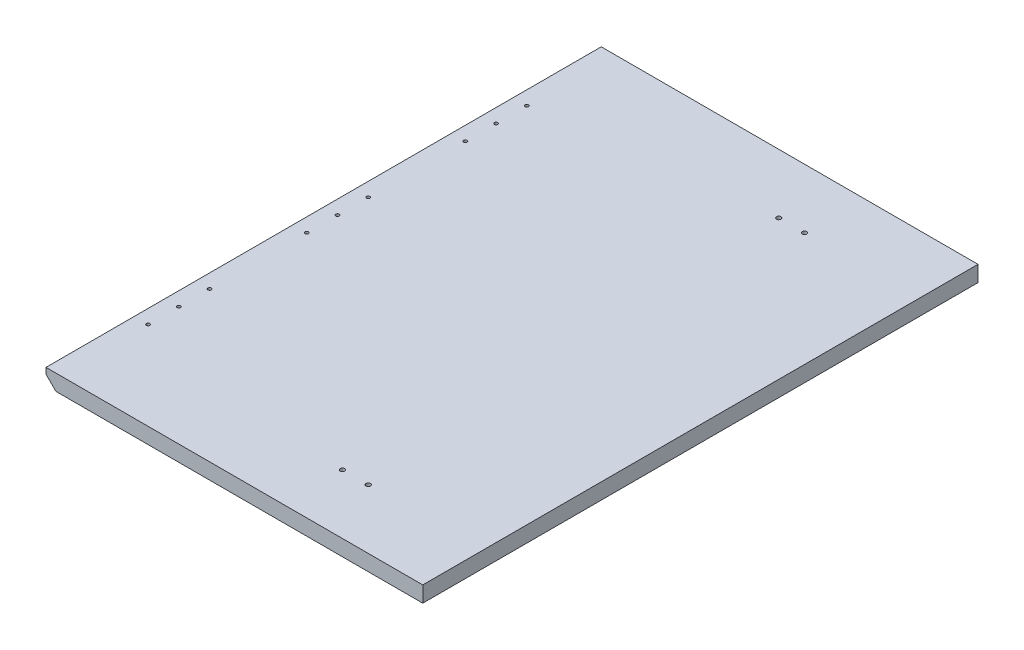
ISO-10303-21;
HEADER;
FILE_DESCRIPTION(('STEP AP214'),'2;1');
FILE_NAME('part.step','',(''),(''),'','','');
FILE_SCHEMA(('AUTOMOTIVE_DESIGN { 1 0 10303 214 1 1 1 1 }'));
ENDSEC;
DATA;
#1=APPLICATION_CONTEXT('core data for automotive mechanical design processes');
#2=APPLICATION_PROTOCOL_DEFINITION('international standard','automotive_design',2000,#1);
#3=PRODUCT_CONTEXT('',#1,'mechanical');
#4=PRODUCT('Part','Part','',(#3));
#5=PRODUCT_RELATED_PRODUCT_CATEGORY('part','',(#4));
#6=PRODUCT_DEFINITION_FORMATION('','',#4);
#7=PRODUCT_DEFINITION_CONTEXT('part definition',#1,'design');
#8=PRODUCT_DEFINITION('design','',#6,#7);
#9=PRODUCT_DEFINITION_SHAPE('','',#8);
#10=(LENGTH_UNIT() NAMED_UNIT(*) SI_UNIT(.MILLI.,.METRE.));
#11=(NAMED_UNIT(*) PLANE_ANGLE_UNIT() SI_UNIT($,.RADIAN.));
#12=(NAMED_UNIT(*) SI_UNIT($,.STERADIAN.) SOLID_ANGLE_UNIT());
#13=UNCERTAINTY_MEASURE_WITH_UNIT(LENGTH_MEASURE(1.E-05),#10,'distance_accuracy_value','');
#14=(GEOMETRIC_REPRESENTATION_CONTEXT(3) GLOBAL_UNCERTAINTY_ASSIGNED_CONTEXT((#13)) GLOBAL_UNIT_ASSIGNED_CONTEXT((#10,
#11,#12)) REPRESENTATION_CONTEXT('',''));
#15=CARTESIAN_POINT('',(0.,0.,0.));
#16=DIRECTION('',(0.,0.,1.));
#17=DIRECTION('',(1.,0.,0.));
#18=AXIS2_PLACEMENT_3D('',#15,#16,#17);
#19=CARTESIAN_POINT('',(190.,16.,280.));
#20=DIRECTION('',(-1.,0.,0.));
#21=DIRECTION('',(0.,0.,1.));
#22=AXIS2_PLACEMENT_3D('',#19,#20,#21);
#23=PLANE('',#22);
#24=DIRECTION('',(0.,0.,-1.));
#25=VECTOR('',#24,1.);
#26=CARTESIAN_POINT('',(190.,0.,280.));
#27=LINE('',#26,#25);
#28=CARTESIAN_POINT('',(190.,0.,280.));
#29=VERTEX_POINT('',#28);
#30=CARTESIAN_POINT('',(190.,0.,-280.));
#31=VERTEX_POINT('',#30);
#32=EDGE_CURVE('E225',#29,#31,#27,.T.);
#33=ORIENTED_EDGE('',*,*,#32,.T.);
#34=DIRECTION('',(0.,-1.,0.));
#35=VECTOR('',#34,1.);
#36=CARTESIAN_POINT('',(190.,16.,-280.));
#37=LINE('',#36,#35);
#38=CARTESIAN_POINT('',(190.,16.,-280.));
#39=VERTEX_POINT('',#38);
#40=EDGE_CURVE('E298',#39,#31,#37,.T.);
#41=ORIENTED_EDGE('',*,*,#40,.F.);
#42=DIRECTION('',(0.,0.,-1.));
#43=VECTOR('',#42,1.);
#44=CARTESIAN_POINT('',(190.,16.,280.));
#45=LINE('',#44,#43);
#46=CARTESIAN_POINT('',(190.,16.,280.));
#47=VERTEX_POINT('',#46);
#48=EDGE_CURVE('E274',#47,#39,#45,.T.);
#49=ORIENTED_EDGE('',*,*,#48,.F.);
#50=DIRECTION('',(0.,-1.,0.));
#51=VECTOR('',#50,1.);
#52=CARTESIAN_POINT('',(190.,16.,280.));
#53=LINE('',#52,#51);
#54=EDGE_CURVE('E284',#47,#29,#53,.T.);
#55=ORIENTED_EDGE('',*,*,#54,.T.);
#56=EDGE_LOOP('',(#33,#41,#49,#55));
#57=FACE_BOUND('',#56,.T.);
#58=ADVANCED_FACE('F47',(#57),#23,.F.);
#59=CARTESIAN_POINT('',(-190.,16.,-280.));
#60=DIRECTION('',(0.,0.,1.));
#61=DIRECTION('',(1.,0.,0.));
#62=AXIS2_PLACEMENT_3D('',#59,#60,#61);
#63=PLANE('',#62);
#64=DIRECTION('',(-1.,0.,0.));
#65=VECTOR('',#64,1.);
#66=CARTESIAN_POINT('',(-190.,0.,-280.));
#67=LINE('',#66,#65);
#68=CARTESIAN_POINT('',(-180.,0.,-280.));
#69=VERTEX_POINT('',#68);
#70=EDGE_CURVE('E287',#31,#69,#67,.T.);
#71=ORIENTED_EDGE('',*,*,#70,.T.);
#72=DIRECTION('',(-0.70710678118655,0.707106781186546,0.));
#73=VECTOR('',#72,1.);
#74=CARTESIAN_POINT('',(-190.,10.0000000000001,-280.));
#75=LINE('',#74,#73);
#76=CARTESIAN_POINT('',(-190.,10.0000000000001,-280.));
#77=VERTEX_POINT('',#76);
#78=EDGE_CURVE('E11',#69,#77,#75,.T.);
#79=ORIENTED_EDGE('',*,*,#78,.T.);
#80=DIRECTION('',(0.,-1.,0.));
#81=VECTOR('',#80,1.);
#82=CARTESIAN_POINT('',(-190.,16.,-280.));
#83=LINE('',#82,#81);
#84=CARTESIAN_POINT('',(-190.,16.,-280.));
#85=VERTEX_POINT('',#84);
#86=EDGE_CURVE('E295',#85,#77,#83,.T.);
#87=ORIENTED_EDGE('',*,*,#86,.F.);
#88=DIRECTION('',(-1.,0.,0.));
#89=VECTOR('',#88,1.);
#90=CARTESIAN_POINT('',(-190.,16.,-280.));
#91=LINE('',#90,#89);
#92=EDGE_CURVE('E277',#39,#85,#91,.T.);
#93=ORIENTED_EDGE('',*,*,#92,.F.);
#94=ORIENTED_EDGE('',*,*,#40,.T.);
#95=EDGE_LOOP('',(#71,#79,#87,#93,#94));
#96=FACE_BOUND('',#95,.T.);
#97=ADVANCED_FACE('F425',(#96),#63,.F.);
#98=CARTESIAN_POINT('',(-190.,16.,280.));
#99=DIRECTION('',(1.,0.,0.));
#100=DIRECTION('',(0.,0.,-1.));
#101=AXIS2_PLACEMENT_3D('',#98,#99,#100);
#102=PLANE('',#101);
#103=DIRECTION('',(0.,0.,-1.));
#104=VECTOR('',#103,1.);
#105=CARTESIAN_POINT('',(-190.,10.,117.5));
#106=LINE('',#105,#104);
#107=CARTESIAN_POINT('',(-190.,10.,202.5));
#108=VERTEX_POINT('',#107);
#109=CARTESIAN_POINT('',(-190.,10.,117.5));
#110=VERTEX_POINT('',#109);
#111=EDGE_CURVE('E185',#108,#110,#106,.T.);
#112=ORIENTED_EDGE('',*,*,#111,.F.);
#113=DIRECTION('',(0.,0.,1.));
#114=VECTOR('',#113,1.);
#115=CARTESIAN_POINT('',(-190.,10.0000000000001,280.));
#116=LINE('',#115,#114);
#117=CARTESIAN_POINT('',(-190.,10.0000000000001,280.));
#118=VERTEX_POINT('',#117);
#119=EDGE_CURVE('E190',#108,#118,#116,.T.);
#120=ORIENTED_EDGE('',*,*,#119,.T.);
#121=DIRECTION('',(0.,-1.,0.));
#122=VECTOR('',#121,1.);
#123=CARTESIAN_POINT('',(-190.,16.,280.));
#124=LINE('',#123,#122);
#125=CARTESIAN_POINT('',(-190.,16.,280.));
#126=VERTEX_POINT('',#125);
#127=EDGE_CURVE('E292',#126,#118,#124,.T.);
#128=ORIENTED_EDGE('',*,*,#127,.F.);
#129=DIRECTION('',(0.,0.,1.));
#130=VECTOR('',#129,1.);
#131=CARTESIAN_POINT('',(-190.,16.,280.));
#132=LINE('',#131,#130);
#133=EDGE_CURVE('E280',#85,#126,#132,.T.);
#134=ORIENTED_EDGE('',*,*,#133,.F.);
#135=ORIENTED_EDGE('',*,*,#86,.T.);
#136=DIRECTION('',(0.,0.,1.));
#137=VECTOR('',#136,1.);
#138=CARTESIAN_POINT('',(-190.,10.0000000000001,-202.5));
#139=LINE('',#138,#137);
#140=CARTESIAN_POINT('',(-190.,10.,-202.5));
#141=VERTEX_POINT('',#140);
#142=EDGE_CURVE('E301',#77,#141,#139,.T.);
#143=ORIENTED_EDGE('',*,*,#142,.T.);
#144=DIRECTION('',(0.,0.,-1.));
#145=VECTOR('',#144,1.);
#146=CARTESIAN_POINT('',(-190.,10.,-202.5));
#147=LINE('',#146,#145);
#148=CARTESIAN_POINT('',(-190.,10.,-117.5));
#149=VERTEX_POINT('',#148);
#150=EDGE_CURVE('E260',#149,#141,#147,.T.);
#151=ORIENTED_EDGE('',*,*,#150,.F.);
#152=DIRECTION('',(0.,0.,1.));
#153=VECTOR('',#152,1.);
#154=CARTESIAN_POINT('',(-190.,10.0000000000001,-42.5));
#155=LINE('',#154,#153);
#156=CARTESIAN_POINT('',(-190.,10.,-42.5));
#157=VERTEX_POINT('',#156);
#158=EDGE_CURVE('E191',#149,#157,#155,.T.);
#159=ORIENTED_EDGE('',*,*,#158,.T.);
#160=DIRECTION('',(0.,0.,-1.));
#161=VECTOR('',#160,1.);
#162=CARTESIAN_POINT('',(-190.,10.,-42.5));
#163=LINE('',#162,#161);
#164=CARTESIAN_POINT('',(-190.,10.,42.5));
#165=VERTEX_POINT('',#164);
#166=EDGE_CURVE('E189',#165,#157,#163,.T.);
#167=ORIENTED_EDGE('',*,*,#166,.F.);
#168=DIRECTION('',(0.,0.,1.));
#169=VECTOR('',#168,1.);
#170=CARTESIAN_POINT('',(-190.,10.0000000000001,117.5));
#171=LINE('',#170,#169);
#172=EDGE_CURVE('E171',#165,#110,#171,.T.);
#173=ORIENTED_EDGE('',*,*,#172,.T.);
#174=EDGE_LOOP('',(#112,#120,#128,#134,#135,#143,#151,#159,#167,#173));
#175=FACE_BOUND('',#174,.T.);
#176=ADVANCED_FACE('F182',(#175),#102,.F.);
#177=CARTESIAN_POINT('',(-190.,16.,280.));
#178=DIRECTION('',(0.,0.,-1.));
#179=DIRECTION('',(-1.,0.,0.));
#180=AXIS2_PLACEMENT_3D('',#177,#178,#179);
#181=PLANE('',#180);
#182=ORIENTED_EDGE('',*,*,#127,.T.);
#183=DIRECTION('',(0.70710678118655,-0.707106781186546,0.));
#184=VECTOR('',#183,1.);
#185=CARTESIAN_POINT('',(-190.,10.0000000000001,280.));
#186=LINE('',#185,#184);
#187=CARTESIAN_POINT('',(-180.,0.,280.));
#188=VERTEX_POINT('',#187);
#189=EDGE_CURVE('E306',#118,#188,#186,.T.);
#190=ORIENTED_EDGE('',*,*,#189,.T.);
#191=DIRECTION('',(1.,0.,0.));
#192=VECTOR('',#191,1.);
#193=CARTESIAN_POINT('',(-190.,0.,280.));
#194=LINE('',#193,#192);
#195=EDGE_CURVE('E278',#188,#29,#194,.T.);
#196=ORIENTED_EDGE('',*,*,#195,.T.);
#197=ORIENTED_EDGE('',*,*,#54,.F.);
#198=DIRECTION('',(1.,0.,0.));
#199=VECTOR('',#198,1.);
#200=CARTESIAN_POINT('',(-190.,16.,280.));
#201=LINE('',#200,#199);
#202=EDGE_CURVE('E282',#126,#47,#201,.T.);
#203=ORIENTED_EDGE('',*,*,#202,.F.);
#204=EDGE_LOOP('',(#182,#190,#196,#197,#203));
#205=FACE_BOUND('',#204,.T.);
#206=ADVANCED_FACE('F500',(#205),#181,.F.);
#207=CARTESIAN_POINT('',(0.,16.,0.));
#208=DIRECTION('',(0.,-1.,0.));
#209=DIRECTION('',(0.,0.,-1.));
#210=AXIS2_PLACEMENT_3D('',#207,#208,#209);
#211=PLANE('',#210);
#212=CARTESIAN_POINT('',(75.,16.,-220.));
#213=DIRECTION('',(0.,-1.,0.));
#214=DIRECTION('',(0.,0.,-1.));
#215=AXIS2_PLACEMENT_3D('',#212,#213,#214);
#216=CIRCLE('',#215,2.24789999999998);
#217=CARTESIAN_POINT('',(75.,16.,-222.2479));
#218=VERTEX_POINT('',#217);
#219=EDGE_CURVE('E52',#218,#218,#216,.T.);
#220=ORIENTED_EDGE('',*,*,#219,.T.);
#221=EDGE_LOOP('',(#220));
#222=FACE_BOUND('',#221,.T.);
#223=CARTESIAN_POINT('',(49.,16.,-220.));
#224=DIRECTION('',(0.,-1.,0.));
#225=DIRECTION('',(0.,0.,-1.));
#226=AXIS2_PLACEMENT_3D('',#223,#224,#225);
#227=CIRCLE('',#226,2.24789999999999);
#228=CARTESIAN_POINT('',(49.,16.,-222.2479));
#229=VERTEX_POINT('',#228);
#230=EDGE_CURVE('E340',#229,#229,#227,.T.);
#231=ORIENTED_EDGE('',*,*,#230,.T.);
#232=EDGE_LOOP('',(#231));
#233=FACE_BOUND('',#232,.T.);
#234=CARTESIAN_POINT('',(75.,16.,220.));
#235=DIRECTION('',(0.,-1.,0.));
#236=DIRECTION('',(0.,0.,-1.));
#237=AXIS2_PLACEMENT_3D('',#234,#235,#236);
#238=CIRCLE('',#237,2.24789999999998);
#239=CARTESIAN_POINT('',(75.,16.,217.7521));
#240=VERTEX_POINT('',#239);
#241=EDGE_CURVE('E336',#240,#240,#238,.T.);
#242=ORIENTED_EDGE('',*,*,#241,.T.);
#243=EDGE_LOOP('',(#242));
#244=FACE_BOUND('',#243,.T.);
#245=CARTESIAN_POINT('',(49.,16.,220.));
#246=DIRECTION('',(0.,-1.,0.));
#247=DIRECTION('',(0.,0.,-1.));
#248=AXIS2_PLACEMENT_3D('',#245,#246,#247);
#249=CIRCLE('',#248,2.24789999999999);
#250=CARTESIAN_POINT('',(49.,16.,217.7521));
#251=VERTEX_POINT('',#250);
#252=EDGE_CURVE('E331',#251,#251,#249,.T.);
#253=ORIENTED_EDGE('',*,*,#252,.T.);
#254=EDGE_LOOP('',(#253));
#255=FACE_BOUND('',#254,.T.);
#256=CARTESIAN_POINT('',(-176.,16.,-129.));
#257=DIRECTION('',(0.,-1.,0.));
#258=DIRECTION('',(0.,0.,-1.));
#259=AXIS2_PLACEMENT_3D('',#256,#257,#258);
#260=CIRCLE('',#259,1.72719999999998);
#261=CARTESIAN_POINT('',(-176.,16.,-130.7272));
#262=VERTEX_POINT('',#261);
#263=EDGE_CURVE('E365',#262,#262,#260,.T.);
#264=ORIENTED_EDGE('',*,*,#263,.T.);
#265=EDGE_LOOP('',(#264));
#266=FACE_BOUND('',#265,.T.);
#267=CARTESIAN_POINT('',(-176.,16.,-160.));
#268=DIRECTION('',(0.,-1.,0.));
#269=DIRECTION('',(0.,0.,-1.));
#270=AXIS2_PLACEMENT_3D('',#267,#268,#269);
#271=CIRCLE('',#270,1.72719999999998);
#272=CARTESIAN_POINT('',(-176.,16.,-161.7272));
#273=VERTEX_POINT('',#272);
#274=EDGE_CURVE('E371',#273,#273,#271,.T.);
#275=ORIENTED_EDGE('',*,*,#274,.T.);
#276=EDGE_LOOP('',(#275));
#277=FACE_BOUND('',#276,.T.);
#278=CARTESIAN_POINT('',(-176.,16.,-191.));
#279=DIRECTION('',(0.,-1.,0.));
#280=DIRECTION('',(0.,0.,-1.));
#281=AXIS2_PLACEMENT_3D('',#278,#279,#280);
#282=CIRCLE('',#281,1.72719999999998);
#283=CARTESIAN_POINT('',(-176.,16.,-192.7272));
#284=VERTEX_POINT('',#283);
#285=EDGE_CURVE('E326',#284,#284,#282,.T.);
#286=ORIENTED_EDGE('',*,*,#285,.T.);
#287=EDGE_LOOP('',(#286));
#288=FACE_BOUND('',#287,.T.);
#289=CARTESIAN_POINT('',(-176.,16.,31.));
#290=DIRECTION('',(0.,-1.,0.));
#291=DIRECTION('',(0.,0.,-1.));
#292=AXIS2_PLACEMENT_3D('',#289,#290,#291);
#293=CIRCLE('',#292,1.72719999999998);
#294=CARTESIAN_POINT('',(-176.,16.,29.2728));
#295=VERTEX_POINT('',#294);
#296=EDGE_CURVE('E378',#295,#295,#293,.T.);
#297=ORIENTED_EDGE('',*,*,#296,.T.);
#298=EDGE_LOOP('',(#297));
#299=FACE_BOUND('',#298,.T.);
#300=CARTESIAN_POINT('',(-176.,16.,0.));
#301=DIRECTION('',(0.,-1.,0.));
#302=DIRECTION('',(0.,0.,-1.));
#303=AXIS2_PLACEMENT_3D('',#300,#301,#302);
#304=CIRCLE('',#303,1.72719999999998);
#305=CARTESIAN_POINT('',(-176.,16.,-1.72719999999996));
#306=VERTEX_POINT('',#305);
#307=EDGE_CURVE('E321',#306,#306,#304,.T.);
#308=ORIENTED_EDGE('',*,*,#307,.T.);
#309=EDGE_LOOP('',(#308));
#310=FACE_BOUND('',#309,.T.);
#311=CARTESIAN_POINT('',(-176.,16.,-31.));
#312=DIRECTION('',(0.,-1.,0.));
#313=DIRECTION('',(0.,0.,-1.));
#314=AXIS2_PLACEMENT_3D('',#311,#312,#313);
#315=CIRCLE('',#314,1.72719999999998);
#316=CARTESIAN_POINT('',(-176.,16.,-32.7272));
#317=VERTEX_POINT('',#316);
#318=EDGE_CURVE('E385',#317,#317,#315,.T.);
#319=ORIENTED_EDGE('',*,*,#318,.T.);
#320=EDGE_LOOP('',(#319));
#321=FACE_BOUND('',#320,.T.);
#322=CARTESIAN_POINT('',(-176.,16.,191.));
#323=DIRECTION('',(0.,-1.,0.));
#324=DIRECTION('',(0.,0.,-1.));
#325=AXIS2_PLACEMENT_3D('',#322,#323,#324);
#326=CIRCLE('',#325,1.72719999999998);
#327=CARTESIAN_POINT('',(-176.,16.,189.2728));
#328=VERTEX_POINT('',#327);
#329=EDGE_CURVE('E391',#328,#328,#326,.T.);
#330=ORIENTED_EDGE('',*,*,#329,.T.);
#331=EDGE_LOOP('',(#330));
#332=FACE_BOUND('',#331,.T.);
#333=CARTESIAN_POINT('',(-176.,16.,160.));
#334=DIRECTION('',(0.,-1.,0.));
#335=DIRECTION('',(0.,0.,-1.));
#336=AXIS2_PLACEMENT_3D('',#333,#334,#335);
#337=CIRCLE('',#336,1.72719999999998);
#338=CARTESIAN_POINT('',(-176.,16.,158.2728));
#339=VERTEX_POINT('',#338);
#340=EDGE_CURVE('E397',#339,#339,#337,.T.);
#341=ORIENTED_EDGE('',*,*,#340,.T.);
#342=EDGE_LOOP('',(#341));
#343=FACE_BOUND('',#342,.T.);
#344=CARTESIAN_POINT('',(-176.,16.,129.));
#345=DIRECTION('',(0.,-1.,0.));
#346=DIRECTION('',(0.,0.,-1.));
#347=AXIS2_PLACEMENT_3D('',#344,#345,#346);
#348=CIRCLE('',#347,1.72719999999998);
#349=CARTESIAN_POINT('',(-176.,16.,127.2728));
#350=VERTEX_POINT('',#349);
#351=EDGE_CURVE('E213',#350,#350,#348,.T.);
#352=ORIENTED_EDGE('',*,*,#351,.T.);
#353=EDGE_LOOP('',(#352));
#354=FACE_BOUND('',#353,.T.);
#355=ORIENTED_EDGE('',*,*,#48,.T.);
#356=ORIENTED_EDGE('',*,*,#92,.T.);
#357=ORIENTED_EDGE('',*,*,#133,.T.);
#358=ORIENTED_EDGE('',*,*,#202,.T.);
#359=EDGE_LOOP('',(#355,#356,#357,#358));
#360=FACE_BOUND('',#359,.T.);
#361=ADVANCED_FACE('F406',(#222,#233,#244,#255,#266,#277,#288,#299,#310,#321,#332,#343,#354,
#360),#211,.F.);
#362=CARTESIAN_POINT('',(0.,0.,0.));
#363=DIRECTION('',(0.,-1.,0.));
#364=DIRECTION('',(0.,0.,-1.));
#365=AXIS2_PLACEMENT_3D('',#362,#363,#364);
#366=PLANE('',#365);
#367=CARTESIAN_POINT('',(75.,0.,-220.));
#368=DIRECTION('',(0.,-1.,0.));
#369=DIRECTION('',(0.,0.,-1.));
#370=AXIS2_PLACEMENT_3D('',#367,#368,#369);
#371=CIRCLE('',#370,4.21639999999999);
#372=CARTESIAN_POINT('',(75.,0.,-224.2164));
#373=VERTEX_POINT('',#372);
#374=EDGE_CURVE('E788',#373,#373,#371,.T.);
#375=ORIENTED_EDGE('',*,*,#374,.F.);
#376=EDGE_LOOP('',(#375));
#377=FACE_BOUND('',#376,.T.);
#378=CARTESIAN_POINT('',(49.,0.,-220.));
#379=DIRECTION('',(0.,-1.,0.));
#380=DIRECTION('',(0.,0.,-1.));
#381=AXIS2_PLACEMENT_3D('',#378,#379,#380);
#382=CIRCLE('',#381,4.2164);
#383=CARTESIAN_POINT('',(49.,0.,-224.2164));
#384=VERTEX_POINT('',#383);
#385=EDGE_CURVE('E349',#384,#384,#382,.T.);
#386=ORIENTED_EDGE('',*,*,#385,.F.);
#387=EDGE_LOOP('',(#386));
#388=FACE_BOUND('',#387,.T.);
#389=CARTESIAN_POINT('',(75.,0.,220.));
#390=DIRECTION('',(0.,-1.,0.));
#391=DIRECTION('',(0.,0.,-1.));
#392=AXIS2_PLACEMENT_3D('',#389,#390,#391);
#393=CIRCLE('',#392,4.21639999999999);
#394=CARTESIAN_POINT('',(75.,0.,215.7836));
#395=VERTEX_POINT('',#394);
#396=EDGE_CURVE('E342',#395,#395,#393,.T.);
#397=ORIENTED_EDGE('',*,*,#396,.F.);
#398=EDGE_LOOP('',(#397));
#399=FACE_BOUND('',#398,.T.);
#400=CARTESIAN_POINT('',(49.,0.,220.));
#401=DIRECTION('',(0.,-1.,0.));
#402=DIRECTION('',(0.,0.,-1.));
#403=AXIS2_PLACEMENT_3D('',#400,#401,#402);
#404=CIRCLE('',#403,4.2164);
#405=CARTESIAN_POINT('',(49.,0.,215.7836));
#406=VERTEX_POINT('',#405);
#407=EDGE_CURVE('E338',#406,#406,#404,.T.);
#408=ORIENTED_EDGE('',*,*,#407,.F.);
#409=EDGE_LOOP('',(#408));
#410=FACE_BOUND('',#409,.T.);
#411=ORIENTED_EDGE('',*,*,#195,.F.);
#412=DIRECTION('',(0.,0.,-1.));
#413=VECTOR('',#412,1.);
#414=CARTESIAN_POINT('',(-180.,0.,202.5));
#415=LINE('',#414,#413);
#416=CARTESIAN_POINT('',(-180.,0.,202.5));
#417=VERTEX_POINT('',#416);
#418=EDGE_CURVE('E312',#188,#417,#415,.T.);
#419=ORIENTED_EDGE('',*,*,#418,.T.);
#420=DIRECTION('',(-1.,0.,0.));
#421=VECTOR('',#420,1.);
#422=CARTESIAN_POINT('',(-190.,0.,202.5));
#423=LINE('',#422,#421);
#424=CARTESIAN_POINT('',(-160.,0.,202.5));
#425=VERTEX_POINT('',#424);
#426=EDGE_CURVE('E207',#425,#417,#423,.T.);
#427=ORIENTED_EDGE('',*,*,#426,.F.);
#428=DIRECTION('',(0.,0.,1.));
#429=VECTOR('',#428,1.);
#430=CARTESIAN_POINT('',(-160.,0.,117.5));
#431=LINE('',#430,#429);
#432=CARTESIAN_POINT('',(-160.,0.,117.5));
#433=VERTEX_POINT('',#432);
#434=EDGE_CURVE('E210',#433,#425,#431,.T.);
#435=ORIENTED_EDGE('',*,*,#434,.F.);
#436=DIRECTION('',(1.,0.,0.));
#437=VECTOR('',#436,1.);
#438=CARTESIAN_POINT('',(-190.,0.,117.5));
#439=LINE('',#438,#437);
#440=CARTESIAN_POINT('',(-180.,0.,117.5));
#441=VERTEX_POINT('',#440);
#442=EDGE_CURVE('E218',#441,#433,#439,.T.);
#443=ORIENTED_EDGE('',*,*,#442,.F.);
#444=DIRECTION('',(0.,0.,-1.));
#445=VECTOR('',#444,1.);
#446=CARTESIAN_POINT('',(-180.,0.,42.5));
#447=LINE('',#446,#445);
#448=CARTESIAN_POINT('',(-180.,0.,42.5));
#449=VERTEX_POINT('',#448);
#450=EDGE_CURVE('E172',#441,#449,#447,.T.);
#451=ORIENTED_EDGE('',*,*,#450,.T.);
#452=DIRECTION('',(-1.,0.,0.));
#453=VECTOR('',#452,1.);
#454=CARTESIAN_POINT('',(-190.,0.,42.5));
#455=LINE('',#454,#453);
#456=CARTESIAN_POINT('',(-160.,0.,42.5));
#457=VERTEX_POINT('',#456);
#458=EDGE_CURVE('E234',#457,#449,#455,.T.);
#459=ORIENTED_EDGE('',*,*,#458,.F.);
#460=DIRECTION('',(0.,0.,1.));
#461=VECTOR('',#460,1.);
#462=CARTESIAN_POINT('',(-160.,0.,-42.5));
#463=LINE('',#462,#461);
#464=CARTESIAN_POINT('',(-160.,0.,-42.5));
#465=VERTEX_POINT('',#464);
#466=EDGE_CURVE('E237',#465,#457,#463,.T.);
#467=ORIENTED_EDGE('',*,*,#466,.F.);
#468=DIRECTION('',(1.,0.,0.));
#469=VECTOR('',#468,1.);
#470=CARTESIAN_POINT('',(-190.,0.,-42.5));
#471=LINE('',#470,#469);
#472=CARTESIAN_POINT('',(-180.,0.,-42.5));
#473=VERTEX_POINT('',#472);
#474=EDGE_CURVE('E220',#473,#465,#471,.T.);
#475=ORIENTED_EDGE('',*,*,#474,.F.);
#476=DIRECTION('',(0.,0.,-1.));
#477=VECTOR('',#476,1.);
#478=CARTESIAN_POINT('',(-180.,0.,-117.5));
#479=LINE('',#478,#477);
#480=CARTESIAN_POINT('',(-180.,0.,-117.5));
#481=VERTEX_POINT('',#480);
#482=EDGE_CURVE('E309',#473,#481,#479,.T.);
#483=ORIENTED_EDGE('',*,*,#482,.T.);
#484=DIRECTION('',(-1.,0.,0.));
#485=VECTOR('',#484,1.);
#486=CARTESIAN_POINT('',(-190.,0.,-117.5));
#487=LINE('',#486,#485);
#488=CARTESIAN_POINT('',(-160.,0.,-117.5));
#489=VERTEX_POINT('',#488);
#490=EDGE_CURVE('E256',#489,#481,#487,.T.);
#491=ORIENTED_EDGE('',*,*,#490,.F.);
#492=DIRECTION('',(0.,0.,1.));
#493=VECTOR('',#492,1.);
#494=CARTESIAN_POINT('',(-160.,0.,-202.5));
#495=LINE('',#494,#493);
#496=CARTESIAN_POINT('',(-160.,0.,-202.5));
#497=VERTEX_POINT('',#496);
#498=EDGE_CURVE('E259',#497,#489,#495,.T.);
#499=ORIENTED_EDGE('',*,*,#498,.F.);
#500=DIRECTION('',(1.,0.,0.));
#501=VECTOR('',#500,1.);
#502=CARTESIAN_POINT('',(-190.,0.,-202.5));
#503=LINE('',#502,#501);
#504=CARTESIAN_POINT('',(-180.,0.,-202.5));
#505=VERTEX_POINT('',#504);
#506=EDGE_CURVE('E233',#505,#497,#503,.T.);
#507=ORIENTED_EDGE('',*,*,#506,.F.);
#508=DIRECTION('',(0.,0.,-1.));
#509=VECTOR('',#508,1.);
#510=CARTESIAN_POINT('',(-180.,0.,-280.));
#511=LINE('',#510,#509);
#512=EDGE_CURVE('E65',#505,#69,#511,.T.);
#513=ORIENTED_EDGE('',*,*,#512,.T.);
#514=ORIENTED_EDGE('',*,*,#70,.F.);
#515=ORIENTED_EDGE('',*,*,#32,.F.);
#516=EDGE_LOOP('',(#411,#419,#427,#435,#443,#451,#459,#467,#475,#483,#491,#499,#507,#513,#514,#515));
#517=FACE_BOUND('',#516,.T.);
#518=ADVANCED_FACE('F475',(#377,#388,#399,#410,#517),#366,.T.);
#519=CARTESIAN_POINT('',(-190.,10.,-117.5));
#520=DIRECTION('',(0.,0.,1.));
#521=DIRECTION('',(1.,0.,0.));
#522=AXIS2_PLACEMENT_3D('',#519,#520,#521);
#523=PLANE('',#522);
#524=ORIENTED_EDGE('',*,*,#490,.T.);
#525=DIRECTION('',(-0.70710678118655,0.707106781186546,0.));
#526=VECTOR('',#525,1.);
#527=CARTESIAN_POINT('',(-190.,10.0000000000001,-117.5));
#528=LINE('',#527,#526);
#529=EDGE_CURVE('E318',#481,#149,#528,.T.);
#530=ORIENTED_EDGE('',*,*,#529,.T.);
#531=DIRECTION('',(-1.,0.,0.));
#532=VECTOR('',#531,1.);
#533=CARTESIAN_POINT('',(-190.,10.,-117.5));
#534=LINE('',#533,#532);
#535=CARTESIAN_POINT('',(-160.,10.,-117.5));
#536=VERTEX_POINT('',#535);
#537=EDGE_CURVE('E253',#536,#149,#534,.T.);
#538=ORIENTED_EDGE('',*,*,#537,.F.);
#539=DIRECTION('',(0.,-1.,0.));
#540=VECTOR('',#539,1.);
#541=CARTESIAN_POINT('',(-160.,10.,-117.5));
#542=LINE('',#541,#540);
#543=EDGE_CURVE('E254',#536,#489,#542,.T.);
#544=ORIENTED_EDGE('',*,*,#543,.T.);
#545=EDGE_LOOP('',(#524,#530,#538,#544));
#546=FACE_BOUND('',#545,.T.);
#547=ADVANCED_FACE('F459',(#546),#523,.F.);
#548=CARTESIAN_POINT('',(-160.,10.,-202.5));
#549=DIRECTION('',(1.,0.,0.));
#550=DIRECTION('',(0.,0.,-1.));
#551=AXIS2_PLACEMENT_3D('',#548,#549,#550);
#552=PLANE('',#551);
#553=ORIENTED_EDGE('',*,*,#498,.T.);
#554=ORIENTED_EDGE('',*,*,#543,.F.);
#555=DIRECTION('',(0.,0.,1.));
#556=VECTOR('',#555,1.);
#557=CARTESIAN_POINT('',(-160.,10.,-202.5));
#558=LINE('',#557,#556);
#559=CARTESIAN_POINT('',(-160.,10.,-202.5));
#560=VERTEX_POINT('',#559);
#561=EDGE_CURVE('E266',#560,#536,#558,.T.);
#562=ORIENTED_EDGE('',*,*,#561,.F.);
#563=DIRECTION('',(0.,-1.,0.));
#564=VECTOR('',#563,1.);
#565=CARTESIAN_POINT('',(-160.,10.,-202.5));
#566=LINE('',#565,#564);
#567=EDGE_CURVE('E250',#560,#497,#566,.T.);
#568=ORIENTED_EDGE('',*,*,#567,.T.);
#569=EDGE_LOOP('',(#553,#554,#562,#568));
#570=FACE_BOUND('',#569,.T.);
#571=ADVANCED_FACE('F473',(#570),#552,.F.);
#572=CARTESIAN_POINT('',(-190.,10.,-202.5));
#573=DIRECTION('',(0.,0.,-1.));
#574=DIRECTION('',(-1.,0.,0.));
#575=AXIS2_PLACEMENT_3D('',#572,#573,#574);
#576=PLANE('',#575);
#577=DIRECTION('',(1.,0.,0.));
#578=VECTOR('',#577,1.);
#579=CARTESIAN_POINT('',(-190.,10.,-202.5));
#580=LINE('',#579,#578);
#581=EDGE_CURVE('E269',#141,#560,#580,.T.);
#582=ORIENTED_EDGE('',*,*,#581,.F.);
#583=DIRECTION('',(0.70710678118655,-0.707106781186546,0.));
#584=VECTOR('',#583,1.);
#585=CARTESIAN_POINT('',(-190.,10.0000000000001,-202.5));
#586=LINE('',#585,#584);
#587=EDGE_CURVE('E57',#141,#505,#586,.T.);
#588=ORIENTED_EDGE('',*,*,#587,.T.);
#589=ORIENTED_EDGE('',*,*,#506,.T.);
#590=ORIENTED_EDGE('',*,*,#567,.F.);
#591=EDGE_LOOP('',(#582,#588,#589,#590));
#592=FACE_BOUND('',#591,.T.);
#593=ADVANCED_FACE('F470',(#592),#576,.F.);
#594=CARTESIAN_POINT('',(0.,10.,0.));
#595=DIRECTION('',(0.,1.,0.));
#596=DIRECTION('',(0.,0.,1.));
#597=AXIS2_PLACEMENT_3D('',#594,#595,#596);
#598=PLANE('',#597);
#599=CARTESIAN_POINT('',(-176.,10.,-129.));
#600=DIRECTION('',(0.,-1.,0.));
#601=DIRECTION('',(0.,0.,-1.));
#602=AXIS2_PLACEMENT_3D('',#599,#600,#601);
#603=CIRCLE('',#602,1.72719999999998);
#604=CARTESIAN_POINT('',(-176.,10.,-130.7272));
#605=VERTEX_POINT('',#604);
#606=EDGE_CURVE('E334',#605,#605,#603,.T.);
#607=ORIENTED_EDGE('',*,*,#606,.F.);
#608=EDGE_LOOP('',(#607));
#609=FACE_BOUND('',#608,.T.);
#610=CARTESIAN_POINT('',(-176.,10.,-160.));
#611=DIRECTION('',(0.,-1.,0.));
#612=DIRECTION('',(0.,0.,-1.));
#613=AXIS2_PLACEMENT_3D('',#610,#611,#612);
#614=CIRCLE('',#613,1.72719999999998);
#615=CARTESIAN_POINT('',(-176.,10.,-161.7272));
#616=VERTEX_POINT('',#615);
#617=EDGE_CURVE('E368',#616,#616,#614,.T.);
#618=ORIENTED_EDGE('',*,*,#617,.F.);
#619=EDGE_LOOP('',(#618));
#620=FACE_BOUND('',#619,.T.);
#621=CARTESIAN_POINT('',(-176.,10.,-191.));
#622=DIRECTION('',(0.,-1.,0.));
#623=DIRECTION('',(0.,0.,-1.));
#624=AXIS2_PLACEMENT_3D('',#621,#622,#623);
#625=CIRCLE('',#624,1.72719999999998);
#626=CARTESIAN_POINT('',(-176.,10.,-192.7272));
#627=VERTEX_POINT('',#626);
#628=EDGE_CURVE('E330',#627,#627,#625,.T.);
#629=ORIENTED_EDGE('',*,*,#628,.F.);
#630=EDGE_LOOP('',(#629));
#631=FACE_BOUND('',#630,.T.);
#632=ORIENTED_EDGE('',*,*,#150,.T.);
#633=ORIENTED_EDGE('',*,*,#581,.T.);
#634=ORIENTED_EDGE('',*,*,#561,.T.);
#635=ORIENTED_EDGE('',*,*,#537,.T.);
#636=EDGE_LOOP('',(#632,#633,#634,#635));
#637=FACE_BOUND('',#636,.T.);
#638=ADVANCED_FACE('F463',(#609,#620,#631,#637),#598,.F.);
#639=CARTESIAN_POINT('',(-190.,10.,42.5));
#640=DIRECTION('',(0.,0.,1.));
#641=DIRECTION('',(1.,0.,0.));
#642=AXIS2_PLACEMENT_3D('',#639,#640,#641);
#643=PLANE('',#642);
#644=ORIENTED_EDGE('',*,*,#458,.T.);
#645=DIRECTION('',(-0.70710678118655,0.707106781186546,0.));
#646=VECTOR('',#645,1.);
#647=CARTESIAN_POINT('',(-190.,10.0000000000001,42.5));
#648=LINE('',#647,#646);
#649=EDGE_CURVE('E176',#449,#165,#648,.T.);
#650=ORIENTED_EDGE('',*,*,#649,.T.);
#651=DIRECTION('',(-1.,0.,0.));
#652=VECTOR('',#651,1.);
#653=CARTESIAN_POINT('',(-190.,10.,42.5));
#654=LINE('',#653,#652);
#655=CARTESIAN_POINT('',(-160.,10.,42.5));
#656=VERTEX_POINT('',#655);
#657=EDGE_CURVE('E230',#656,#165,#654,.T.);
#658=ORIENTED_EDGE('',*,*,#657,.F.);
#659=DIRECTION('',(0.,-1.,0.));
#660=VECTOR('',#659,1.);
#661=CARTESIAN_POINT('',(-160.,10.,42.5));
#662=LINE('',#661,#660);
#663=EDGE_CURVE('E231',#656,#457,#662,.T.);
#664=ORIENTED_EDGE('',*,*,#663,.T.);
#665=EDGE_LOOP('',(#644,#650,#658,#664));
#666=FACE_BOUND('',#665,.T.);
#667=ADVANCED_FACE('F488',(#666),#643,.F.);
#668=CARTESIAN_POINT('',(-160.,10.,-42.5));
#669=DIRECTION('',(1.,0.,0.));
#670=DIRECTION('',(0.,0.,-1.));
#671=AXIS2_PLACEMENT_3D('',#668,#669,#670);
#672=PLANE('',#671);
#673=ORIENTED_EDGE('',*,*,#466,.T.);
#674=ORIENTED_EDGE('',*,*,#663,.F.);
#675=DIRECTION('',(0.,0.,1.));
#676=VECTOR('',#675,1.);
#677=CARTESIAN_POINT('',(-160.,10.,-42.5));
#678=LINE('',#677,#676);
#679=CARTESIAN_POINT('',(-160.,10.,-42.5));
#680=VERTEX_POINT('',#679);
#681=EDGE_CURVE('E243',#680,#656,#678,.T.);
#682=ORIENTED_EDGE('',*,*,#681,.F.);
#683=DIRECTION('',(0.,-1.,0.));
#684=VECTOR('',#683,1.);
#685=CARTESIAN_POINT('',(-160.,10.,-42.5));
#686=LINE('',#685,#684);
#687=EDGE_CURVE('E227',#680,#465,#686,.T.);
#688=ORIENTED_EDGE('',*,*,#687,.T.);
#689=EDGE_LOOP('',(#673,#674,#682,#688));
#690=FACE_BOUND('',#689,.T.);
#691=ADVANCED_FACE('F483',(#690),#672,.F.);
#692=CARTESIAN_POINT('',(-190.,10.,-42.5));
#693=DIRECTION('',(0.,0.,-1.));
#694=DIRECTION('',(-1.,0.,0.));
#695=AXIS2_PLACEMENT_3D('',#692,#693,#694);
#696=PLANE('',#695);
#697=DIRECTION('',(1.,0.,0.));
#698=VECTOR('',#697,1.);
#699=CARTESIAN_POINT('',(-190.,10.,-42.5));
#700=LINE('',#699,#698);
#701=EDGE_CURVE('E246',#157,#680,#700,.T.);
#702=ORIENTED_EDGE('',*,*,#701,.F.);
#703=DIRECTION('',(0.70710678118655,-0.707106781186546,0.));
#704=VECTOR('',#703,1.);
#705=CARTESIAN_POINT('',(-190.,10.0000000000001,-42.5));
#706=LINE('',#705,#704);
#707=EDGE_CURVE('E316',#157,#473,#706,.T.);
#708=ORIENTED_EDGE('',*,*,#707,.T.);
#709=ORIENTED_EDGE('',*,*,#474,.T.);
#710=ORIENTED_EDGE('',*,*,#687,.F.);
#711=EDGE_LOOP('',(#702,#708,#709,#710));
#712=FACE_BOUND('',#711,.T.);
#713=ADVANCED_FACE('F480',(#712),#696,.F.);
#714=CARTESIAN_POINT('',(0.,10.,0.));
#715=DIRECTION('',(0.,1.,0.));
#716=DIRECTION('',(0.,0.,1.));
#717=AXIS2_PLACEMENT_3D('',#714,#715,#716);
#718=PLANE('',#717);
#719=CARTESIAN_POINT('',(-176.,10.,31.));
#720=DIRECTION('',(0.,-1.,0.));
#721=DIRECTION('',(0.,0.,-1.));
#722=AXIS2_PLACEMENT_3D('',#719,#720,#721);
#723=CIRCLE('',#722,1.72719999999998);
#724=CARTESIAN_POINT('',(-176.,10.,29.2728));
#725=VERTEX_POINT('',#724);
#726=EDGE_CURVE('E329',#725,#725,#723,.T.);
#727=ORIENTED_EDGE('',*,*,#726,.F.);
#728=EDGE_LOOP('',(#727));
#729=FACE_BOUND('',#728,.T.);
#730=CARTESIAN_POINT('',(-176.,10.,0.));
#731=DIRECTION('',(0.,-1.,0.));
#732=DIRECTION('',(0.,0.,-1.));
#733=AXIS2_PLACEMENT_3D('',#730,#731,#732);
#734=CIRCLE('',#733,1.72719999999998);
#735=CARTESIAN_POINT('',(-176.,10.,-1.72719999999996));
#736=VERTEX_POINT('',#735);
#737=EDGE_CURVE('E325',#736,#736,#734,.T.);
#738=ORIENTED_EDGE('',*,*,#737,.F.);
#739=EDGE_LOOP('',(#738));
#740=FACE_BOUND('',#739,.T.);
#741=CARTESIAN_POINT('',(-176.,10.,-31.));
#742=DIRECTION('',(0.,-1.,0.));
#743=DIRECTION('',(0.,0.,-1.));
#744=AXIS2_PLACEMENT_3D('',#741,#742,#743);
#745=CIRCLE('',#744,1.72719999999998);
#746=CARTESIAN_POINT('',(-176.,10.,-32.7272));
#747=VERTEX_POINT('',#746);
#748=EDGE_CURVE('E324',#747,#747,#745,.T.);
#749=ORIENTED_EDGE('',*,*,#748,.F.);
#750=EDGE_LOOP('',(#749));
#751=FACE_BOUND('',#750,.T.);
#752=ORIENTED_EDGE('',*,*,#166,.T.);
#753=ORIENTED_EDGE('',*,*,#701,.T.);
#754=ORIENTED_EDGE('',*,*,#681,.T.);
#755=ORIENTED_EDGE('',*,*,#657,.T.);
#756=EDGE_LOOP('',(#752,#753,#754,#755));
#757=FACE_BOUND('',#756,.T.);
#758=ADVANCED_FACE('F486',(#729,#740,#751,#757),#718,.F.);
#759=CARTESIAN_POINT('',(-190.,10.,202.5));
#760=DIRECTION('',(0.,0.,1.));
#761=DIRECTION('',(1.,0.,0.));
#762=AXIS2_PLACEMENT_3D('',#759,#760,#761);
#763=PLANE('',#762);
#764=ORIENTED_EDGE('',*,*,#426,.T.);
#765=DIRECTION('',(-0.70710678118655,0.707106781186546,0.));
#766=VECTOR('',#765,1.);
#767=CARTESIAN_POINT('',(-190.,10.0000000000001,202.5));
#768=LINE('',#767,#766);
#769=EDGE_CURVE('E177',#417,#108,#768,.T.);
#770=ORIENTED_EDGE('',*,*,#769,.T.);
#771=DIRECTION('',(-1.,0.,0.));
#772=VECTOR('',#771,1.);
#773=CARTESIAN_POINT('',(-190.,10.,202.5));
#774=LINE('',#773,#772);
#775=CARTESIAN_POINT('',(-160.,10.,202.5));
#776=VERTEX_POINT('',#775);
#777=EDGE_CURVE('E206',#776,#108,#774,.T.);
#778=ORIENTED_EDGE('',*,*,#777,.F.);
#779=DIRECTION('',(0.,-1.,0.));
#780=VECTOR('',#779,1.);
#781=CARTESIAN_POINT('',(-160.,10.,202.5));
#782=LINE('',#781,#780);
#783=EDGE_CURVE('E223',#776,#425,#782,.T.);
#784=ORIENTED_EDGE('',*,*,#783,.T.);
#785=EDGE_LOOP('',(#764,#770,#778,#784));
#786=FACE_BOUND('',#785,.T.);
#787=ADVANCED_FACE('F494',(#786),#763,.F.);
#788=CARTESIAN_POINT('',(-160.,10.,117.5));
#789=DIRECTION('',(1.,0.,0.));
#790=DIRECTION('',(0.,0.,-1.));
#791=AXIS2_PLACEMENT_3D('',#788,#789,#790);
#792=PLANE('',#791);
#793=ORIENTED_EDGE('',*,*,#434,.T.);
#794=ORIENTED_EDGE('',*,*,#783,.F.);
#795=DIRECTION('',(0.,0.,1.));
#796=VECTOR('',#795,1.);
#797=CARTESIAN_POINT('',(-160.,10.,117.5));
#798=LINE('',#797,#796);
#799=CARTESIAN_POINT('',(-160.,10.,117.5));
#800=VERTEX_POINT('',#799);
#801=EDGE_CURVE('E201',#800,#776,#798,.T.);
#802=ORIENTED_EDGE('',*,*,#801,.F.);
#803=DIRECTION('',(0.,-1.,0.));
#804=VECTOR('',#803,1.);
#805=CARTESIAN_POINT('',(-160.,10.,117.5));
#806=LINE('',#805,#804);
#807=EDGE_CURVE('E197',#800,#433,#806,.T.);
#808=ORIENTED_EDGE('',*,*,#807,.T.);
#809=EDGE_LOOP('',(#793,#794,#802,#808));
#810=FACE_BOUND('',#809,.T.);
#811=ADVANCED_FACE('F492',(#810),#792,.F.);
#812=CARTESIAN_POINT('',(-190.,10.,117.5));
#813=DIRECTION('',(0.,0.,-1.));
#814=DIRECTION('',(-1.,0.,0.));
#815=AXIS2_PLACEMENT_3D('',#812,#813,#814);
#816=PLANE('',#815);
#817=DIRECTION('',(1.,0.,0.));
#818=VECTOR('',#817,1.);
#819=CARTESIAN_POINT('',(-190.,10.,117.5));
#820=LINE('',#819,#818);
#821=EDGE_CURVE('E194',#110,#800,#820,.T.);
#822=ORIENTED_EDGE('',*,*,#821,.F.);
#823=DIRECTION('',(0.70710678118655,-0.707106781186546,0.));
#824=VECTOR('',#823,1.);
#825=CARTESIAN_POINT('',(-190.,10.0000000000001,117.5));
#826=LINE('',#825,#824);
#827=EDGE_CURVE('E167',#110,#441,#826,.T.);
#828=ORIENTED_EDGE('',*,*,#827,.T.);
#829=ORIENTED_EDGE('',*,*,#442,.T.);
#830=ORIENTED_EDGE('',*,*,#807,.F.);
#831=EDGE_LOOP('',(#822,#828,#829,#830));
#832=FACE_BOUND('',#831,.T.);
#833=ADVANCED_FACE('F195',(#832),#816,.F.);
#834=CARTESIAN_POINT('',(0.,10.,0.));
#835=DIRECTION('',(0.,1.,0.));
#836=DIRECTION('',(0.,0.,1.));
#837=AXIS2_PLACEMENT_3D('',#834,#835,#836);
#838=PLANE('',#837);
#839=CARTESIAN_POINT('',(-176.,10.,191.));
#840=DIRECTION('',(0.,-1.,0.));
#841=DIRECTION('',(0.,0.,-1.));
#842=AXIS2_PLACEMENT_3D('',#839,#840,#841);
#843=CIRCLE('',#842,1.72719999999998);
#844=CARTESIAN_POINT('',(-176.,10.,189.2728));
#845=VERTEX_POINT('',#844);
#846=EDGE_CURVE('E388',#845,#845,#843,.T.);
#847=ORIENTED_EDGE('',*,*,#846,.F.);
#848=EDGE_LOOP('',(#847));
#849=FACE_BOUND('',#848,.T.);
#850=CARTESIAN_POINT('',(-176.,10.,160.));
#851=DIRECTION('',(0.,-1.,0.));
#852=DIRECTION('',(0.,0.,-1.));
#853=AXIS2_PLACEMENT_3D('',#850,#851,#852);
#854=CIRCLE('',#853,1.72719999999998);
#855=CARTESIAN_POINT('',(-176.,10.,158.2728));
#856=VERTEX_POINT('',#855);
#857=EDGE_CURVE('E394',#856,#856,#854,.T.);
#858=ORIENTED_EDGE('',*,*,#857,.F.);
#859=EDGE_LOOP('',(#858));
#860=FACE_BOUND('',#859,.T.);
#861=CARTESIAN_POINT('',(-176.,10.,129.));
#862=DIRECTION('',(0.,-1.,0.));
#863=DIRECTION('',(0.,0.,-1.));
#864=AXIS2_PLACEMENT_3D('',#861,#862,#863);
#865=CIRCLE('',#864,1.72719999999998);
#866=CARTESIAN_POINT('',(-176.,10.,127.2728));
#867=VERTEX_POINT('',#866);
#868=EDGE_CURVE('E399',#867,#867,#865,.T.);
#869=ORIENTED_EDGE('',*,*,#868,.F.);
#870=EDGE_LOOP('',(#869));
#871=FACE_BOUND('',#870,.T.);
#872=ORIENTED_EDGE('',*,*,#111,.T.);
#873=ORIENTED_EDGE('',*,*,#821,.T.);
#874=ORIENTED_EDGE('',*,*,#801,.T.);
#875=ORIENTED_EDGE('',*,*,#777,.T.);
#876=EDGE_LOOP('',(#872,#873,#874,#875));
#877=FACE_BOUND('',#876,.T.);
#878=ADVANCED_FACE('F204',(#849,#860,#871,#877),#838,.F.);
#879=CARTESIAN_POINT('',(-190.,10.0000000000001,280.));
#880=DIRECTION('',(-0.707106781186545,-0.707106781186549,0.));
#881=DIRECTION('',(0.,0.,-1.));
#882=AXIS2_PLACEMENT_3D('',#879,#880,#881);
#883=PLANE('',#882);
#884=ORIENTED_EDGE('',*,*,#769,.F.);
#885=ORIENTED_EDGE('',*,*,#418,.F.);
#886=ORIENTED_EDGE('',*,*,#189,.F.);
#887=ORIENTED_EDGE('',*,*,#119,.F.);
#888=EDGE_LOOP('',(#884,#885,#886,#887));
#889=FACE_BOUND('',#888,.T.);
#890=ADVANCED_FACE('F437',(#889),#883,.T.);
#891=CARTESIAN_POINT('',(-190.,10.0000000000001,280.));
#892=DIRECTION('',(-0.707106781186545,-0.707106781186549,0.));
#893=DIRECTION('',(0.,0.,-1.));
#894=AXIS2_PLACEMENT_3D('',#891,#892,#893);
#895=PLANE('',#894);
#896=ORIENTED_EDGE('',*,*,#649,.F.);
#897=ORIENTED_EDGE('',*,*,#450,.F.);
#898=ORIENTED_EDGE('',*,*,#827,.F.);
#899=ORIENTED_EDGE('',*,*,#172,.F.);
#900=EDGE_LOOP('',(#896,#897,#898,#899));
#901=FACE_BOUND('',#900,.T.);
#902=ADVANCED_FACE('F170',(#901),#895,.T.);
#903=CARTESIAN_POINT('',(-190.,10.0000000000001,280.));
#904=DIRECTION('',(-0.707106781186545,-0.707106781186549,0.));
#905=DIRECTION('',(0.,0.,-1.));
#906=AXIS2_PLACEMENT_3D('',#903,#904,#905);
#907=PLANE('',#906);
#908=ORIENTED_EDGE('',*,*,#529,.F.);
#909=ORIENTED_EDGE('',*,*,#482,.F.);
#910=ORIENTED_EDGE('',*,*,#707,.F.);
#911=ORIENTED_EDGE('',*,*,#158,.F.);
#912=EDGE_LOOP('',(#908,#909,#910,#911));
#913=FACE_BOUND('',#912,.T.);
#914=ADVANCED_FACE('F421',(#913),#907,.T.);
#915=CARTESIAN_POINT('',(-190.,10.0000000000001,280.));
#916=DIRECTION('',(-0.707106781186545,-0.707106781186549,0.));
#917=DIRECTION('',(0.,0.,-1.));
#918=AXIS2_PLACEMENT_3D('',#915,#916,#917);
#919=PLANE('',#918);
#920=ORIENTED_EDGE('',*,*,#78,.F.);
#921=ORIENTED_EDGE('',*,*,#512,.F.);
#922=ORIENTED_EDGE('',*,*,#587,.F.);
#923=ORIENTED_EDGE('',*,*,#142,.F.);
#924=EDGE_LOOP('',(#920,#921,#922,#923));
#925=FACE_BOUND('',#924,.T.);
#926=ADVANCED_FACE('F50',(#925),#919,.T.);
#927=CARTESIAN_POINT('',(-176.,10.,129.));
#928=DIRECTION('',(0.,-1.,0.));
#929=DIRECTION('',(0.,0.,-1.));
#930=AXIS2_PLACEMENT_3D('',#927,#928,#929);
#931=CYLINDRICAL_SURFACE('',#930,1.72719999999998);
#932=ORIENTED_EDGE('',*,*,#868,.T.);
#933=EDGE_LOOP('',(#932));
#934=FACE_BOUND('',#933,.T.);
#935=ORIENTED_EDGE('',*,*,#351,.F.);
#936=EDGE_LOOP('',(#935));
#937=FACE_BOUND('',#936,.T.);
#938=ADVANCED_FACE('F409',(#934,#937),#931,.F.);
#939=CARTESIAN_POINT('',(-176.,10.,160.));
#940=DIRECTION('',(0.,-1.,0.));
#941=DIRECTION('',(0.,0.,-1.));
#942=AXIS2_PLACEMENT_3D('',#939,#940,#941);
#943=CYLINDRICAL_SURFACE('',#942,1.72719999999998);
#944=ORIENTED_EDGE('',*,*,#857,.T.);
#945=EDGE_LOOP('',(#944));
#946=FACE_BOUND('',#945,.T.);
#947=ORIENTED_EDGE('',*,*,#340,.F.);
#948=EDGE_LOOP('',(#947));
#949=FACE_BOUND('',#948,.T.);
#950=ADVANCED_FACE('F411',(#946,#949),#943,.F.);
#951=CARTESIAN_POINT('',(-176.,10.,191.));
#952=DIRECTION('',(0.,-1.,0.));
#953=DIRECTION('',(0.,0.,-1.));
#954=AXIS2_PLACEMENT_3D('',#951,#952,#953);
#955=CYLINDRICAL_SURFACE('',#954,1.72719999999998);
#956=ORIENTED_EDGE('',*,*,#846,.T.);
#957=EDGE_LOOP('',(#956));
#958=FACE_BOUND('',#957,.T.);
#959=ORIENTED_EDGE('',*,*,#329,.F.);
#960=EDGE_LOOP('',(#959));
#961=FACE_BOUND('',#960,.T.);
#962=ADVANCED_FACE('F417',(#958,#961),#955,.F.);
#963=CARTESIAN_POINT('',(-176.,10.,-31.));
#964=DIRECTION('',(0.,-1.,0.));
#965=DIRECTION('',(0.,0.,-1.));
#966=AXIS2_PLACEMENT_3D('',#963,#964,#965);
#967=CYLINDRICAL_SURFACE('',#966,1.72719999999998);
#968=ORIENTED_EDGE('',*,*,#748,.T.);
#969=EDGE_LOOP('',(#968));
#970=FACE_BOUND('',#969,.T.);
#971=ORIENTED_EDGE('',*,*,#318,.F.);
#972=EDGE_LOOP('',(#971));
#973=FACE_BOUND('',#972,.T.);
#974=ADVANCED_FACE('F626',(#970,#973),#967,.F.);
#975=CARTESIAN_POINT('',(-176.,10.,0.));
#976=DIRECTION('',(0.,-1.,0.));
#977=DIRECTION('',(0.,0.,-1.));
#978=AXIS2_PLACEMENT_3D('',#975,#976,#977);
#979=CYLINDRICAL_SURFACE('',#978,1.72719999999998);
#980=ORIENTED_EDGE('',*,*,#737,.T.);
#981=EDGE_LOOP('',(#980));
#982=FACE_BOUND('',#981,.T.);
#983=ORIENTED_EDGE('',*,*,#307,.F.);
#984=EDGE_LOOP('',(#983));
#985=FACE_BOUND('',#984,.T.);
#986=ADVANCED_FACE('F639',(#982,#985),#979,.F.);
#987=CARTESIAN_POINT('',(-176.,10.,31.));
#988=DIRECTION('',(0.,-1.,0.));
#989=DIRECTION('',(0.,0.,-1.));
#990=AXIS2_PLACEMENT_3D('',#987,#988,#989);
#991=CYLINDRICAL_SURFACE('',#990,1.72719999999998);
#992=ORIENTED_EDGE('',*,*,#726,.T.);
#993=EDGE_LOOP('',(#992));
#994=FACE_BOUND('',#993,.T.);
#995=ORIENTED_EDGE('',*,*,#296,.F.);
#996=EDGE_LOOP('',(#995));
#997=FACE_BOUND('',#996,.T.);
#998=ADVANCED_FACE('F652',(#994,#997),#991,.F.);
#999=CARTESIAN_POINT('',(-176.,10.,-191.));
#1000=DIRECTION('',(0.,-1.,0.));
#1001=DIRECTION('',(0.,0.,-1.));
#1002=AXIS2_PLACEMENT_3D('',#999,#1000,#1001);
#1003=CYLINDRICAL_SURFACE('',#1002,1.72719999999998);
#1004=ORIENTED_EDGE('',*,*,#628,.T.);
#1005=EDGE_LOOP('',(#1004));
#1006=FACE_BOUND('',#1005,.T.);
#1007=ORIENTED_EDGE('',*,*,#285,.F.);
#1008=EDGE_LOOP('',(#1007));
#1009=FACE_BOUND('',#1008,.T.);
#1010=ADVANCED_FACE('F664',(#1006,#1009),#1003,.F.);
#1011=CARTESIAN_POINT('',(-176.,10.,-160.));
#1012=DIRECTION('',(0.,-1.,0.));
#1013=DIRECTION('',(0.,0.,-1.));
#1014=AXIS2_PLACEMENT_3D('',#1011,#1012,#1013);
#1015=CYLINDRICAL_SURFACE('',#1014,1.72719999999998);
#1016=ORIENTED_EDGE('',*,*,#617,.T.);
#1017=EDGE_LOOP('',(#1016));
#1018=FACE_BOUND('',#1017,.T.);
#1019=ORIENTED_EDGE('',*,*,#274,.F.);
#1020=EDGE_LOOP('',(#1019));
#1021=FACE_BOUND('',#1020,.T.);
#1022=ADVANCED_FACE('F676',(#1018,#1021),#1015,.F.);
#1023=CARTESIAN_POINT('',(-176.,10.,-129.));
#1024=DIRECTION('',(0.,-1.,0.));
#1025=DIRECTION('',(0.,0.,-1.));
#1026=AXIS2_PLACEMENT_3D('',#1023,#1024,#1025);
#1027=CYLINDRICAL_SURFACE('',#1026,1.72719999999998);
#1028=ORIENTED_EDGE('',*,*,#606,.T.);
#1029=EDGE_LOOP('',(#1028));
#1030=FACE_BOUND('',#1029,.T.);
#1031=ORIENTED_EDGE('',*,*,#263,.F.);
#1032=EDGE_LOOP('',(#1031));
#1033=FACE_BOUND('',#1032,.T.);
#1034=ADVANCED_FACE('F688',(#1030,#1033),#1027,.F.);
#1035=CARTESIAN_POINT('',(49.,0.,220.));
#1036=DIRECTION('',(0.,-1.,0.));
#1037=DIRECTION('',(0.,0.,-1.));
#1038=AXIS2_PLACEMENT_3D('',#1035,#1036,#1037);
#1039=CYLINDRICAL_SURFACE('',#1038,2.24789999999999);
#1040=CARTESIAN_POINT('',(49.,1.65176762397247,220.));
#1041=DIRECTION('',(0.,-1.,0.));
#1042=DIRECTION('',(0.,0.,-1.));
#1043=AXIS2_PLACEMENT_3D('',#1040,#1041,#1042);
#1044=CIRCLE('',#1043,2.24789999999999);
#1045=CARTESIAN_POINT('',(49.,1.65176762397247,217.7521));
#1046=VERTEX_POINT('',#1045);
#1047=EDGE_CURVE('E335',#1046,#1046,#1044,.T.);
#1048=ORIENTED_EDGE('',*,*,#1047,.T.);
#1049=EDGE_LOOP('',(#1048));
#1050=FACE_BOUND('',#1049,.T.);
#1051=ORIENTED_EDGE('',*,*,#252,.F.);
#1052=EDGE_LOOP('',(#1051));
#1053=FACE_BOUND('',#1052,.T.);
#1054=ADVANCED_FACE('F700',(#1050,#1053),#1039,.F.);
#1055=CARTESIAN_POINT('',(49.,0.,220.));
#1056=DIRECTION('',(0.,-1.,0.));
#1057=DIRECTION('',(0.,0.,-1.));
#1058=AXIS2_PLACEMENT_3D('',#1055,#1056,#1057);
#1059=CONICAL_SURFACE('',#1058,4.2164,0.872664625997169);
#1060=ORIENTED_EDGE('',*,*,#1047,.F.);
#1061=EDGE_LOOP('',(#1060));
#1062=FACE_BOUND('',#1061,.T.);
#1063=ORIENTED_EDGE('',*,*,#407,.T.);
#1064=EDGE_LOOP('',(#1063));
#1065=FACE_BOUND('',#1064,.T.);
#1066=ADVANCED_FACE('F711',(#1062,#1065),#1059,.F.);
#1067=CARTESIAN_POINT('',(75.,0.,220.));
#1068=DIRECTION('',(0.,-1.,0.));
#1069=DIRECTION('',(0.,0.,-1.));
#1070=AXIS2_PLACEMENT_3D('',#1067,#1068,#1069);
#1071=CYLINDRICAL_SURFACE('',#1070,2.24789999999998);
#1072=CARTESIAN_POINT('',(75.,1.65176762397247,220.));
#1073=DIRECTION('',(0.,-1.,0.));
#1074=DIRECTION('',(0.,0.,-1.));
#1075=AXIS2_PLACEMENT_3D('',#1072,#1073,#1074);
#1076=CIRCLE('',#1075,2.24789999999998);
#1077=CARTESIAN_POINT('',(75.,1.65176762397247,217.7521));
#1078=VERTEX_POINT('',#1077);
#1079=EDGE_CURVE('E339',#1078,#1078,#1076,.T.);
#1080=ORIENTED_EDGE('',*,*,#1079,.T.);
#1081=EDGE_LOOP('',(#1080));
#1082=FACE_BOUND('',#1081,.T.);
#1083=ORIENTED_EDGE('',*,*,#241,.F.);
#1084=EDGE_LOOP('',(#1083));
#1085=FACE_BOUND('',#1084,.T.);
#1086=ADVANCED_FACE('F721',(#1082,#1085),#1071,.F.);
#1087=CARTESIAN_POINT('',(75.,0.,220.));
#1088=DIRECTION('',(0.,-1.,0.));
#1089=DIRECTION('',(0.,0.,-1.));
#1090=AXIS2_PLACEMENT_3D('',#1087,#1088,#1089);
#1091=CONICAL_SURFACE('',#1090,4.21639999999999,0.872664625997169);
#1092=ORIENTED_EDGE('',*,*,#1079,.F.);
#1093=EDGE_LOOP('',(#1092));
#1094=FACE_BOUND('',#1093,.T.);
#1095=ORIENTED_EDGE('',*,*,#396,.T.);
#1096=EDGE_LOOP('',(#1095));
#1097=FACE_BOUND('',#1096,.T.);
#1098=ADVANCED_FACE('F731',(#1094,#1097),#1091,.F.);
#1099=CARTESIAN_POINT('',(49.,0.,-220.));
#1100=DIRECTION('',(0.,-1.,0.));
#1101=DIRECTION('',(0.,0.,-1.));
#1102=AXIS2_PLACEMENT_3D('',#1099,#1100,#1101);
#1103=CYLINDRICAL_SURFACE('',#1102,2.24789999999999);
#1104=CARTESIAN_POINT('',(49.,1.65176762397247,-220.));
#1105=DIRECTION('',(0.,-1.,0.));
#1106=DIRECTION('',(0.,0.,-1.));
#1107=AXIS2_PLACEMENT_3D('',#1104,#1105,#1106);
#1108=CIRCLE('',#1107,2.24789999999999);
#1109=CARTESIAN_POINT('',(49.,1.65176762397247,-222.2479));
#1110=VERTEX_POINT('',#1109);
#1111=EDGE_CURVE('E343',#1110,#1110,#1108,.T.);
#1112=ORIENTED_EDGE('',*,*,#1111,.T.);
#1113=EDGE_LOOP('',(#1112));
#1114=FACE_BOUND('',#1113,.T.);
#1115=ORIENTED_EDGE('',*,*,#230,.F.);
#1116=EDGE_LOOP('',(#1115));
#1117=FACE_BOUND('',#1116,.T.);
#1118=ADVANCED_FACE('F740',(#1114,#1117),#1103,.F.);
#1119=CARTESIAN_POINT('',(49.,0.,-220.));
#1120=DIRECTION('',(0.,-1.,0.));
#1121=DIRECTION('',(0.,0.,-1.));
#1122=AXIS2_PLACEMENT_3D('',#1119,#1120,#1121);
#1123=CONICAL_SURFACE('',#1122,4.2164,0.872664625997169);
#1124=ORIENTED_EDGE('',*,*,#1111,.F.);
#1125=EDGE_LOOP('',(#1124));
#1126=FACE_BOUND('',#1125,.T.);
#1127=ORIENTED_EDGE('',*,*,#385,.T.);
#1128=EDGE_LOOP('',(#1127));
#1129=FACE_BOUND('',#1128,.T.);
#1130=ADVANCED_FACE('F750',(#1126,#1129),#1123,.F.);
#1131=CARTESIAN_POINT('',(75.,0.,-220.));
#1132=DIRECTION('',(0.,-1.,0.));
#1133=DIRECTION('',(0.,0.,-1.));
#1134=AXIS2_PLACEMENT_3D('',#1131,#1132,#1133);
#1135=CYLINDRICAL_SURFACE('',#1134,2.24789999999998);
#1136=CARTESIAN_POINT('',(75.,1.65176762397247,-220.));
#1137=DIRECTION('',(0.,-1.,0.));
#1138=DIRECTION('',(0.,0.,-1.));
#1139=AXIS2_PLACEMENT_3D('',#1136,#1137,#1138);
#1140=CIRCLE('',#1139,2.24789999999998);
#1141=CARTESIAN_POINT('',(75.,1.65176762397247,-222.2479));
#1142=VERTEX_POINT('',#1141);
#1143=EDGE_CURVE('E785',#1142,#1142,#1140,.T.);
#1144=ORIENTED_EDGE('',*,*,#1143,.T.);
#1145=EDGE_LOOP('',(#1144));
#1146=FACE_BOUND('',#1145,.T.);
#1147=ORIENTED_EDGE('',*,*,#219,.F.);
#1148=EDGE_LOOP('',(#1147));
#1149=FACE_BOUND('',#1148,.T.);
#1150=ADVANCED_FACE('F759',(#1146,#1149),#1135,.F.);
#1151=CARTESIAN_POINT('',(75.,0.,-220.));
#1152=DIRECTION('',(0.,-1.,0.));
#1153=DIRECTION('',(0.,0.,-1.));
#1154=AXIS2_PLACEMENT_3D('',#1151,#1152,#1153);
#1155=CONICAL_SURFACE('',#1154,4.21639999999999,0.872664625997169);
#1156=ORIENTED_EDGE('',*,*,#1143,.F.);
#1157=EDGE_LOOP('',(#1156));
#1158=FACE_BOUND('',#1157,.T.);
#1159=ORIENTED_EDGE('',*,*,#374,.T.);
#1160=EDGE_LOOP('',(#1159));
#1161=FACE_BOUND('',#1160,.T.);
#1162=ADVANCED_FACE('F769',(#1158,#1161),#1155,.F.);
#1163=CLOSED_SHELL('',(#58,#97,#176,#206,#361,#518,#547,#571,#593,#638,#667,#691,#713,#758,#787,
#811,#833,#878,#890,#902,#914,#926,#938,#950,#962,#974,#986,#998,#1010,#1022,#1034,#1054,#1066,
#1086,#1098,#1118,#1130,#1150,#1162));
#1164=MANIFOLD_SOLID_BREP('B2',#1163);
#1165=ADVANCED_BREP_SHAPE_REPRESENTATION('',(#18,#1164),#14);
#1166=SHAPE_DEFINITION_REPRESENTATION(#9,#1165);
ENDSEC;
END-ISO-10303-21;
